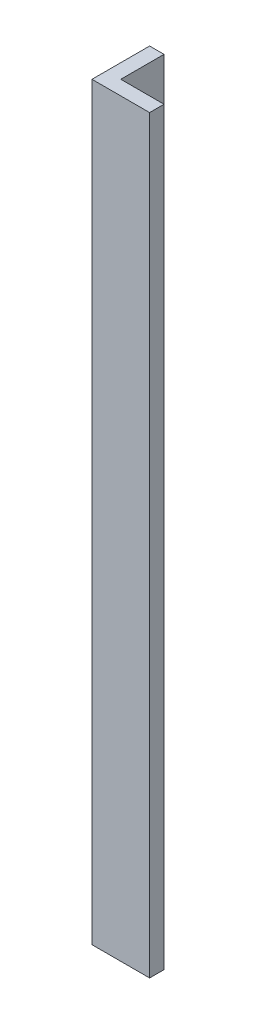
ISO-10303-21;
HEADER;
FILE_DESCRIPTION(('STEP AP214'),'2;1');
FILE_NAME('part.step','',(''),(''),'','','');
FILE_SCHEMA(('AUTOMOTIVE_DESIGN { 1 0 10303 214 1 1 1 1 }'));
ENDSEC;
DATA;
#1=APPLICATION_CONTEXT('core data for automotive mechanical design processes');
#2=APPLICATION_PROTOCOL_DEFINITION('international standard','automotive_design',2000,#1);
#3=PRODUCT_CONTEXT('',#1,'mechanical');
#4=PRODUCT('Part','Part','',(#3));
#5=PRODUCT_RELATED_PRODUCT_CATEGORY('part','',(#4));
#6=PRODUCT_DEFINITION_FORMATION('','',#4);
#7=PRODUCT_DEFINITION_CONTEXT('part definition',#1,'design');
#8=PRODUCT_DEFINITION('design','',#6,#7);
#9=PRODUCT_DEFINITION_SHAPE('','',#8);
#10=(LENGTH_UNIT() NAMED_UNIT(*) SI_UNIT(.MILLI.,.METRE.));
#11=(NAMED_UNIT(*) PLANE_ANGLE_UNIT() SI_UNIT($,.RADIAN.));
#12=(NAMED_UNIT(*) SI_UNIT($,.STERADIAN.) SOLID_ANGLE_UNIT());
#13=UNCERTAINTY_MEASURE_WITH_UNIT(LENGTH_MEASURE(1.E-05),#10,'distance_accuracy_value','');
#14=(GEOMETRIC_REPRESENTATION_CONTEXT(3) GLOBAL_UNCERTAINTY_ASSIGNED_CONTEXT((#13)) GLOBAL_UNIT_ASSIGNED_CONTEXT((#10,
#11,#12)) REPRESENTATION_CONTEXT('',''));
#15=CARTESIAN_POINT('',(0.,0.,0.));
#16=DIRECTION('',(0.,0.,1.));
#17=DIRECTION('',(1.,0.,0.));
#18=AXIS2_PLACEMENT_3D('',#15,#16,#17);
#19=CARTESIAN_POINT('',(3.09677419354837,260.,0.));
#20=DIRECTION('',(1.,0.,0.));
#21=DIRECTION('',(0.,0.,-1.));
#22=AXIS2_PLACEMENT_3D('',#19,#20,#21);
#23=PLANE('',#22);
#24=DIRECTION('',(0.,0.,1.));
#25=VECTOR('',#24,1.);
#26=CARTESIAN_POINT('',(3.09677419354837,0.,0.));
#27=LINE('',#26,#25);
#28=CARTESIAN_POINT('',(3.09677419354838,0.,5.64516129032258));
#29=VERTEX_POINT('',#28);
#30=CARTESIAN_POINT('',(3.09677419354839,0.,10.6451612903226));
#31=VERTEX_POINT('',#30);
#32=EDGE_CURVE('E131',#29,#31,#27,.T.);
#33=ORIENTED_EDGE('',*,*,#32,.F.);
#34=DIRECTION('',(0.,-1.,0.));
#35=VECTOR('',#34,1.);
#36=CARTESIAN_POINT('',(3.09677419354838,260.,5.64516129032258));
#37=LINE('',#36,#35);
#38=CARTESIAN_POINT('',(3.09677419354838,260.,5.64516129032258));
#39=VERTEX_POINT('',#38);
#40=EDGE_CURVE('E11',#39,#29,#37,.T.);
#41=ORIENTED_EDGE('',*,*,#40,.F.);
#42=DIRECTION('',(0.,0.,1.));
#43=VECTOR('',#42,1.);
#44=CARTESIAN_POINT('',(3.09677419354837,260.,0.));
#45=LINE('',#44,#43);
#46=CARTESIAN_POINT('',(3.09677419354839,260.,10.6451612903226));
#47=VERTEX_POINT('',#46);
#48=EDGE_CURVE('E150',#39,#47,#45,.T.);
#49=ORIENTED_EDGE('',*,*,#48,.T.);
#50=DIRECTION('',(0.,-1.,0.));
#51=VECTOR('',#50,1.);
#52=CARTESIAN_POINT('',(3.09677419354839,260.,10.6451612903226));
#53=LINE('',#52,#51);
#54=EDGE_CURVE('E88',#47,#31,#53,.T.);
#55=ORIENTED_EDGE('',*,*,#54,.T.);
#56=EDGE_LOOP('',(#33,#41,#49,#55));
#57=FACE_BOUND('',#56,.T.);
#58=ADVANCED_FACE('F43',(#57),#23,.T.);
#59=CARTESIAN_POINT('',(0.,260.,5.64516129032258));
#60=DIRECTION('',(0.,0.,-1.));
#61=DIRECTION('',(-1.,0.,0.));
#62=AXIS2_PLACEMENT_3D('',#59,#60,#61);
#63=PLANE('',#62);
#64=DIRECTION('',(1.,0.,0.));
#65=VECTOR('',#64,1.);
#66=CARTESIAN_POINT('',(0.,0.,5.64516129032258));
#67=LINE('',#66,#65);
#68=CARTESIAN_POINT('',(-11.9032258064516,0.,5.64516129032258));
#69=VERTEX_POINT('',#68);
#70=EDGE_CURVE('E135',#69,#29,#67,.T.);
#71=ORIENTED_EDGE('',*,*,#70,.F.);
#72=DIRECTION('',(0.,-1.,0.));
#73=VECTOR('',#72,1.);
#74=CARTESIAN_POINT('',(-11.9032258064516,260.,5.64516129032258));
#75=LINE('',#74,#73);
#76=CARTESIAN_POINT('',(-11.9032258064516,260.,5.64516129032258));
#77=VERTEX_POINT('',#76);
#78=EDGE_CURVE('E52',#77,#69,#75,.T.);
#79=ORIENTED_EDGE('',*,*,#78,.F.);
#80=DIRECTION('',(1.,0.,0.));
#81=VECTOR('',#80,1.);
#82=CARTESIAN_POINT('',(0.,260.,5.64516129032258));
#83=LINE('',#82,#81);
#84=EDGE_CURVE('E125',#77,#39,#83,.T.);
#85=ORIENTED_EDGE('',*,*,#84,.T.);
#86=ORIENTED_EDGE('',*,*,#40,.T.);
#87=EDGE_LOOP('',(#71,#79,#85,#86));
#88=FACE_BOUND('',#87,.T.);
#89=ADVANCED_FACE('F163',(#88),#63,.T.);
#90=CARTESIAN_POINT('',(-11.9032258064516,260.,0.));
#91=DIRECTION('',(1.,0.,0.));
#92=DIRECTION('',(0.,0.,-1.));
#93=AXIS2_PLACEMENT_3D('',#90,#91,#92);
#94=PLANE('',#93);
#95=DIRECTION('',(0.,0.,1.));
#96=VECTOR('',#95,1.);
#97=CARTESIAN_POINT('',(-11.9032258064516,0.,0.));
#98=LINE('',#97,#96);
#99=CARTESIAN_POINT('',(-11.9032258064516,0.,-9.35483870967742));
#100=VERTEX_POINT('',#99);
#101=EDGE_CURVE('E139',#100,#69,#98,.T.);
#102=ORIENTED_EDGE('',*,*,#101,.F.);
#103=DIRECTION('',(0.,-1.,0.));
#104=VECTOR('',#103,1.);
#105=CARTESIAN_POINT('',(-11.9032258064516,260.,-9.35483870967742));
#106=LINE('',#105,#104);
#107=CARTESIAN_POINT('',(-11.9032258064516,260.,-9.35483870967742));
#108=VERTEX_POINT('',#107);
#109=EDGE_CURVE('E110',#108,#100,#106,.T.);
#110=ORIENTED_EDGE('',*,*,#109,.F.);
#111=DIRECTION('',(0.,0.,1.));
#112=VECTOR('',#111,1.);
#113=CARTESIAN_POINT('',(-11.9032258064516,260.,0.));
#114=LINE('',#113,#112);
#115=EDGE_CURVE('E121',#108,#77,#114,.T.);
#116=ORIENTED_EDGE('',*,*,#115,.T.);
#117=ORIENTED_EDGE('',*,*,#78,.T.);
#118=EDGE_LOOP('',(#102,#110,#116,#117));
#119=FACE_BOUND('',#118,.T.);
#120=ADVANCED_FACE('F160',(#119),#94,.T.);
#121=CARTESIAN_POINT('',(0.,260.,-9.35483870967742));
#122=DIRECTION('',(0.,0.,-1.));
#123=DIRECTION('',(-1.,0.,0.));
#124=AXIS2_PLACEMENT_3D('',#121,#122,#123);
#125=PLANE('',#124);
#126=DIRECTION('',(1.,0.,0.));
#127=VECTOR('',#126,1.);
#128=CARTESIAN_POINT('',(0.,0.,-9.35483870967742));
#129=LINE('',#128,#127);
#130=CARTESIAN_POINT('',(-16.9032258064516,0.,-9.35483870967742));
#131=VERTEX_POINT('',#130);
#132=EDGE_CURVE('E108',#131,#100,#129,.T.);
#133=ORIENTED_EDGE('',*,*,#132,.F.);
#134=DIRECTION('',(0.,-1.,0.));
#135=VECTOR('',#134,1.);
#136=CARTESIAN_POINT('',(-16.9032258064516,260.,-9.35483870967742));
#137=LINE('',#136,#135);
#138=CARTESIAN_POINT('',(-16.9032258064516,260.,-9.35483870967742));
#139=VERTEX_POINT('',#138);
#140=EDGE_CURVE('E102',#139,#131,#137,.T.);
#141=ORIENTED_EDGE('',*,*,#140,.F.);
#142=DIRECTION('',(1.,0.,0.));
#143=VECTOR('',#142,1.);
#144=CARTESIAN_POINT('',(0.,260.,-9.35483870967742));
#145=LINE('',#144,#143);
#146=EDGE_CURVE('E106',#139,#108,#145,.T.);
#147=ORIENTED_EDGE('',*,*,#146,.T.);
#148=ORIENTED_EDGE('',*,*,#109,.T.);
#149=EDGE_LOOP('',(#133,#141,#147,#148));
#150=FACE_BOUND('',#149,.T.);
#151=ADVANCED_FACE('F104',(#150),#125,.T.);
#152=CARTESIAN_POINT('',(-16.9032258064516,260.,0.));
#153=DIRECTION('',(1.,0.,0.));
#154=DIRECTION('',(0.,0.,-1.));
#155=AXIS2_PLACEMENT_3D('',#152,#153,#154);
#156=PLANE('',#155);
#157=DIRECTION('',(0.,0.,1.));
#158=VECTOR('',#157,1.);
#159=CARTESIAN_POINT('',(-16.9032258064516,0.,0.));
#160=LINE('',#159,#158);
#161=CARTESIAN_POINT('',(-16.9032258064516,0.,10.6451612903226));
#162=VERTEX_POINT('',#161);
#163=EDGE_CURVE('E81',#131,#162,#160,.T.);
#164=ORIENTED_EDGE('',*,*,#163,.T.);
#165=DIRECTION('',(0.,-1.,0.));
#166=VECTOR('',#165,1.);
#167=CARTESIAN_POINT('',(-16.9032258064516,260.,10.6451612903226));
#168=LINE('',#167,#166);
#169=CARTESIAN_POINT('',(-16.9032258064516,260.,10.6451612903226));
#170=VERTEX_POINT('',#169);
#171=EDGE_CURVE('E111',#170,#162,#168,.T.);
#172=ORIENTED_EDGE('',*,*,#171,.F.);
#173=DIRECTION('',(0.,0.,1.));
#174=VECTOR('',#173,1.);
#175=CARTESIAN_POINT('',(-16.9032258064516,260.,0.));
#176=LINE('',#175,#174);
#177=EDGE_CURVE('E113',#139,#170,#176,.T.);
#178=ORIENTED_EDGE('',*,*,#177,.F.);
#179=ORIENTED_EDGE('',*,*,#140,.T.);
#180=EDGE_LOOP('',(#164,#172,#178,#179));
#181=FACE_BOUND('',#180,.T.);
#182=ADVANCED_FACE('F114',(#181),#156,.F.);
#183=CARTESIAN_POINT('',(0.,260.,10.6451612903226));
#184=DIRECTION('',(0.,0.,-1.));
#185=DIRECTION('',(-1.,0.,0.));
#186=AXIS2_PLACEMENT_3D('',#183,#184,#185);
#187=PLANE('',#186);
#188=DIRECTION('',(1.,0.,0.));
#189=VECTOR('',#188,1.);
#190=CARTESIAN_POINT('',(0.,0.,10.6451612903226));
#191=LINE('',#190,#189);
#192=EDGE_CURVE('E147',#162,#31,#191,.T.);
#193=ORIENTED_EDGE('',*,*,#192,.T.);
#194=ORIENTED_EDGE('',*,*,#54,.F.);
#195=DIRECTION('',(1.,0.,0.));
#196=VECTOR('',#195,1.);
#197=CARTESIAN_POINT('',(0.,260.,10.6451612903226));
#198=LINE('',#197,#196);
#199=EDGE_CURVE('E60',#170,#47,#198,.T.);
#200=ORIENTED_EDGE('',*,*,#199,.F.);
#201=ORIENTED_EDGE('',*,*,#171,.T.);
#202=EDGE_LOOP('',(#193,#194,#200,#201));
#203=FACE_BOUND('',#202,.T.);
#204=ADVANCED_FACE('F168',(#203),#187,.F.);
#205=CARTESIAN_POINT('',(0.,260.,0.));
#206=DIRECTION('',(0.,1.,0.));
#207=DIRECTION('',(0.,0.,1.));
#208=AXIS2_PLACEMENT_3D('',#205,#206,#207);
#209=PLANE('',#208);
#210=ORIENTED_EDGE('',*,*,#48,.F.);
#211=ORIENTED_EDGE('',*,*,#84,.F.);
#212=ORIENTED_EDGE('',*,*,#115,.F.);
#213=ORIENTED_EDGE('',*,*,#146,.F.);
#214=ORIENTED_EDGE('',*,*,#177,.T.);
#215=ORIENTED_EDGE('',*,*,#199,.T.);
#216=EDGE_LOOP('',(#210,#211,#212,#213,#214,#215));
#217=FACE_BOUND('',#216,.T.);
#218=ADVANCED_FACE('F118',(#217),#209,.T.);
#219=CARTESIAN_POINT('',(0.,0.,0.));
#220=DIRECTION('',(0.,1.,0.));
#221=DIRECTION('',(0.,0.,1.));
#222=AXIS2_PLACEMENT_3D('',#219,#220,#221);
#223=PLANE('',#222);
#224=ORIENTED_EDGE('',*,*,#32,.T.);
#225=ORIENTED_EDGE('',*,*,#192,.F.);
#226=ORIENTED_EDGE('',*,*,#163,.F.);
#227=ORIENTED_EDGE('',*,*,#132,.T.);
#228=ORIENTED_EDGE('',*,*,#101,.T.);
#229=ORIENTED_EDGE('',*,*,#70,.T.);
#230=EDGE_LOOP('',(#224,#225,#226,#227,#228,#229));
#231=FACE_BOUND('',#230,.T.);
#232=ADVANCED_FACE('F165',(#231),#223,.F.);
#233=CLOSED_SHELL('',(#58,#89,#120,#151,#182,#204,#218,#232));
#234=MANIFOLD_SOLID_BREP('B2',#233);
#235=ADVANCED_BREP_SHAPE_REPRESENTATION('',(#18,#234),#14);
#236=SHAPE_DEFINITION_REPRESENTATION(#9,#235);
ENDSEC;
END-ISO-10303-21;
